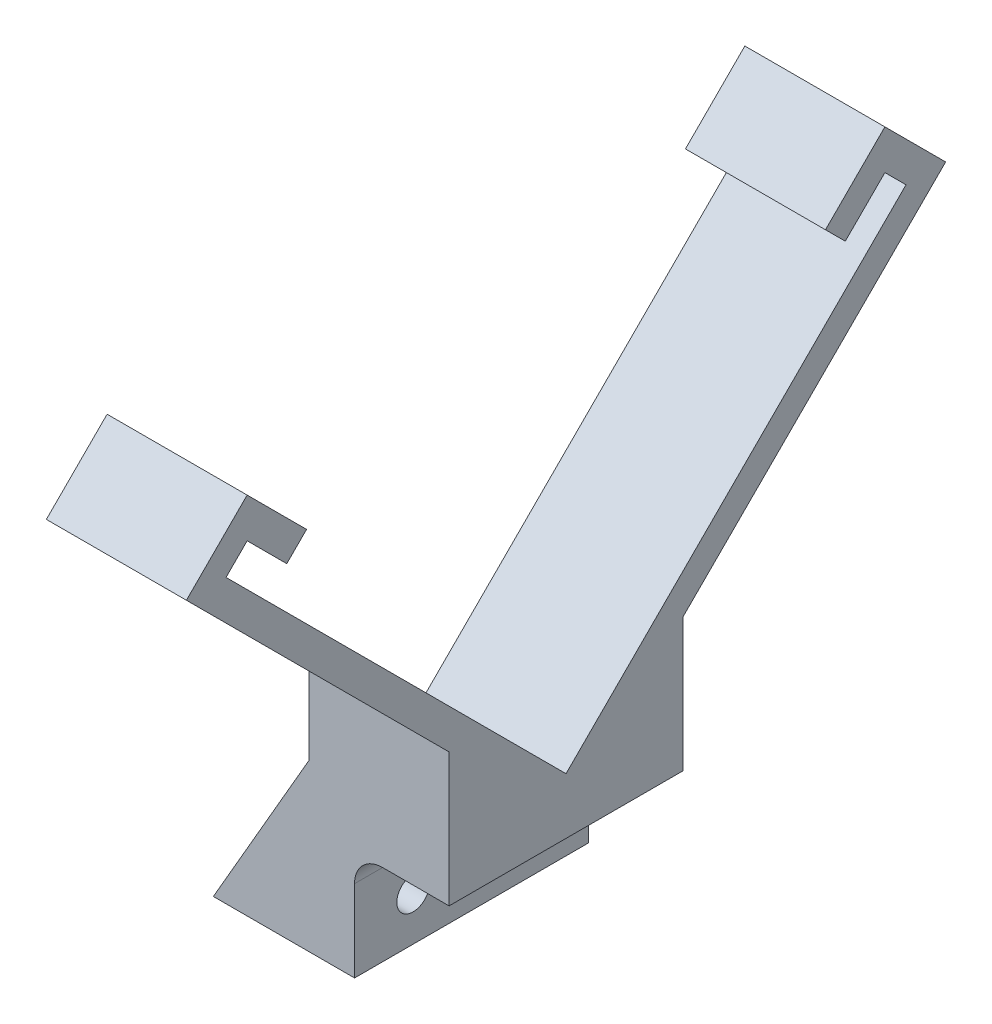
ISO-10303-21;
HEADER;
FILE_DESCRIPTION(('STEP AP214'),'2;1');
FILE_NAME('part.step','',(''),(''),'','','');
FILE_SCHEMA(('AUTOMOTIVE_DESIGN { 1 0 10303 214 1 1 1 1 }'));
ENDSEC;
DATA;
#1=APPLICATION_CONTEXT('core data for automotive mechanical design processes');
#2=APPLICATION_PROTOCOL_DEFINITION('international standard','automotive_design',2000,#1);
#3=PRODUCT_CONTEXT('',#1,'mechanical');
#4=PRODUCT('Part','Part','',(#3));
#5=PRODUCT_RELATED_PRODUCT_CATEGORY('part','',(#4));
#6=PRODUCT_DEFINITION_FORMATION('','',#4);
#7=PRODUCT_DEFINITION_CONTEXT('part definition',#1,'design');
#8=PRODUCT_DEFINITION('design','',#6,#7);
#9=PRODUCT_DEFINITION_SHAPE('','',#8);
#10=(LENGTH_UNIT() NAMED_UNIT(*) SI_UNIT(.MILLI.,.METRE.));
#11=(NAMED_UNIT(*) PLANE_ANGLE_UNIT() SI_UNIT($,.RADIAN.));
#12=(NAMED_UNIT(*) SI_UNIT($,.STERADIAN.) SOLID_ANGLE_UNIT());
#13=UNCERTAINTY_MEASURE_WITH_UNIT(LENGTH_MEASURE(1.E-05),#10,'distance_accuracy_value','');
#14=(GEOMETRIC_REPRESENTATION_CONTEXT(3) GLOBAL_UNCERTAINTY_ASSIGNED_CONTEXT((#13)) GLOBAL_UNIT_ASSIGNED_CONTEXT((#10,
#11,#12)) REPRESENTATION_CONTEXT('',''));
#15=CARTESIAN_POINT('',(0.,0.,0.));
#16=DIRECTION('',(0.,0.,1.));
#17=DIRECTION('',(1.,0.,0.));
#18=AXIS2_PLACEMENT_3D('',#15,#16,#17);
#19=CARTESIAN_POINT('',(0.,0.,25.05));
#20=DIRECTION('',(0.866025403784436,-0.500000000000004,0.));
#21=DIRECTION('',(0.500000000000004,0.866025403784436,0.));
#22=AXIS2_PLACEMENT_3D('',#19,#20,#21);
#23=PLANE('',#22);
#24=CARTESIAN_POINT('',(-7.50555349946521,-13.,6.275));
#25=DIRECTION('',(0.866025403784436,-0.500000000000004,0.));
#26=DIRECTION('',(0.500000000000004,0.866025403784436,0.));
#27=AXIS2_PLACEMENT_3D('',#24,#25,#26);
#28=ELLIPSE('',#27,2.0207259421637,1.75);
#29=CARTESIAN_POINT('',(-6.49519052838335,-11.25,6.275));
#30=VERTEX_POINT('',#29);
#31=EDGE_CURVE('E315',#30,#30,#28,.T.);
#32=ORIENTED_EDGE('',*,*,#31,.T.);
#33=EDGE_LOOP('',(#32));
#34=FACE_BOUND('',#33,.T.);
#35=CARTESIAN_POINT('',(-7.50555349946521,-13.,18.775));
#36=DIRECTION('',(0.866025403784436,-0.500000000000004,0.));
#37=DIRECTION('',(0.500000000000004,0.866025403784436,0.));
#38=AXIS2_PLACEMENT_3D('',#35,#36,#37);
#39=ELLIPSE('',#38,2.0207259421637,1.75);
#40=CARTESIAN_POINT('',(-6.49519052838336,-11.25,18.775));
#41=VERTEX_POINT('',#40);
#42=EDGE_CURVE('E321',#41,#41,#39,.T.);
#43=ORIENTED_EDGE('',*,*,#42,.T.);
#44=EDGE_LOOP('',(#43));
#45=FACE_BOUND('',#44,.T.);
#46=DIRECTION('',(-0.500000000000004,-0.866025403784436,0.));
#47=VECTOR('',#46,1.);
#48=CARTESIAN_POINT('',(0.,0.,0.));
#49=LINE('',#48,#47);
#50=CARTESIAN_POINT('',(0.,0.,0.));
#51=VERTEX_POINT('',#50);
#52=CARTESIAN_POINT('',(-10.247967278116,-17.75,0.));
#53=VERTEX_POINT('',#52);
#54=EDGE_CURVE('E184',#51,#53,#49,.T.);
#55=ORIENTED_EDGE('',*,*,#54,.T.);
#56=DIRECTION('',(0.,0.,-1.));
#57=VECTOR('',#56,1.);
#58=CARTESIAN_POINT('',(-10.247967278116,-17.75,25.05));
#59=LINE('',#58,#57);
#60=CARTESIAN_POINT('',(-10.247967278116,-17.75,25.05));
#61=VERTEX_POINT('',#60);
#62=EDGE_CURVE('E349',#61,#53,#59,.T.);
#63=ORIENTED_EDGE('',*,*,#62,.F.);
#64=DIRECTION('',(-0.500000000000004,-0.866025403784436,0.));
#65=VECTOR('',#64,1.);
#66=CARTESIAN_POINT('',(0.,0.,25.05));
#67=LINE('',#66,#65);
#68=CARTESIAN_POINT('',(0.,0.,25.05));
#69=VERTEX_POINT('',#68);
#70=EDGE_CURVE('E324',#69,#61,#67,.T.);
#71=ORIENTED_EDGE('',*,*,#70,.F.);
#72=DIRECTION('',(0.,0.,-1.));
#73=VECTOR('',#72,1.);
#74=CARTESIAN_POINT('',(0.,0.,25.05));
#75=LINE('',#74,#73);
#76=CARTESIAN_POINT('',(0.,0.,12.525));
#77=VERTEX_POINT('',#76);
#78=EDGE_CURVE('E352',#69,#77,#75,.T.);
#79=ORIENTED_EDGE('',*,*,#78,.T.);
#80=DIRECTION('',(0.,0.,1.));
#81=VECTOR('',#80,1.);
#82=CARTESIAN_POINT('',(0.,0.,25.05));
#83=LINE('',#82,#81);
#84=EDGE_CURVE('E285',#51,#77,#83,.T.);
#85=ORIENTED_EDGE('',*,*,#84,.F.);
#86=EDGE_LOOP('',(#55,#63,#71,#79,#85));
#87=FACE_BOUND('',#86,.T.);
#88=ADVANCED_FACE('F32',(#34,#45,#87),#23,.F.);
#89=CARTESIAN_POINT('',(-10.247967278116,-17.75,25.05));
#90=DIRECTION('',(0.,1.,0.));
#91=DIRECTION('',(0.,0.,1.));
#92=AXIS2_PLACEMENT_3D('',#89,#90,#91);
#93=PLANE('',#92);
#94=DIRECTION('',(1.,0.,0.));
#95=VECTOR('',#94,1.);
#96=CARTESIAN_POINT('',(-10.247967278116,-17.75,0.));
#97=LINE('',#96,#95);
#98=CARTESIAN_POINT('',(4.87601636094202,-17.75,0.));
#99=VERTEX_POINT('',#98);
#100=EDGE_CURVE('E337',#53,#99,#97,.T.);
#101=ORIENTED_EDGE('',*,*,#100,.T.);
#102=DIRECTION('',(0.,0.,-1.));
#103=VECTOR('',#102,1.);
#104=CARTESIAN_POINT('',(4.87601636094202,-17.75,25.05));
#105=LINE('',#104,#103);
#106=CARTESIAN_POINT('',(4.87601636094202,-17.75,25.05));
#107=VERTEX_POINT('',#106);
#108=EDGE_CURVE('E346',#107,#99,#105,.T.);
#109=ORIENTED_EDGE('',*,*,#108,.F.);
#110=DIRECTION('',(1.,0.,0.));
#111=VECTOR('',#110,1.);
#112=CARTESIAN_POINT('',(-10.247967278116,-17.75,25.05));
#113=LINE('',#112,#111);
#114=EDGE_CURVE('E326',#61,#107,#113,.T.);
#115=ORIENTED_EDGE('',*,*,#114,.F.);
#116=ORIENTED_EDGE('',*,*,#62,.T.);
#117=EDGE_LOOP('',(#101,#109,#115,#116));
#118=FACE_BOUND('',#117,.T.);
#119=ADVANCED_FACE('F388',(#118),#93,.F.);
#120=CARTESIAN_POINT('',(4.87601636094202,-17.75,25.05));
#121=DIRECTION('',(-1.,0.,0.));
#122=DIRECTION('',(0.,0.,1.));
#123=AXIS2_PLACEMENT_3D('',#120,#121,#122);
#124=PLANE('',#123);
#125=CARTESIAN_POINT('',(4.87601636094203,-13.,6.275));
#126=DIRECTION('',(1.,0.,0.));
#127=DIRECTION('',(0.,1.,0.));
#128=AXIS2_PLACEMENT_3D('',#125,#126,#127);
#129=CIRCLE('',#128,1.75);
#130=CARTESIAN_POINT('',(4.87601636094203,-11.25,6.275));
#131=VERTEX_POINT('',#130);
#132=EDGE_CURVE('E312',#131,#131,#129,.T.);
#133=ORIENTED_EDGE('',*,*,#132,.F.);
#134=EDGE_LOOP('',(#133));
#135=FACE_BOUND('',#134,.T.);
#136=CARTESIAN_POINT('',(4.87601636094203,-13.,18.775));
#137=DIRECTION('',(1.,0.,0.));
#138=DIRECTION('',(0.,1.,0.));
#139=AXIS2_PLACEMENT_3D('',#136,#137,#138);
#140=CIRCLE('',#139,1.75);
#141=CARTESIAN_POINT('',(4.87601636094203,-11.25,18.775));
#142=VERTEX_POINT('',#141);
#143=EDGE_CURVE('E318',#142,#142,#140,.T.);
#144=ORIENTED_EDGE('',*,*,#143,.F.);
#145=EDGE_LOOP('',(#144));
#146=FACE_BOUND('',#145,.T.);
#147=DIRECTION('',(0.,1.,0.));
#148=VECTOR('',#147,1.);
#149=CARTESIAN_POINT('',(4.87601636094202,-17.75,0.));
#150=LINE('',#149,#148);
#151=CARTESIAN_POINT('',(4.87601636094202,-9.,0.));
#152=VERTEX_POINT('',#151);
#153=EDGE_CURVE('E339',#99,#152,#150,.T.);
#154=ORIENTED_EDGE('',*,*,#153,.T.);
#155=DIRECTION('',(0.,0.,-1.));
#156=VECTOR('',#155,1.);
#157=CARTESIAN_POINT('',(4.87601636094202,-9.,25.05));
#158=LINE('',#157,#156);
#159=CARTESIAN_POINT('',(4.87601636094202,-9.,25.05));
#160=VERTEX_POINT('',#159);
#161=EDGE_CURVE('E55',#152,#160,#158,.F.);
#162=ORIENTED_EDGE('',*,*,#161,.T.);
#163=DIRECTION('',(0.,1.,0.));
#164=VECTOR('',#163,1.);
#165=CARTESIAN_POINT('',(4.87601636094202,-17.75,25.05));
#166=LINE('',#165,#164);
#167=EDGE_CURVE('E329',#107,#160,#166,.T.);
#168=ORIENTED_EDGE('',*,*,#167,.F.);
#169=ORIENTED_EDGE('',*,*,#108,.T.);
#170=EDGE_LOOP('',(#154,#162,#168,#169));
#171=FACE_BOUND('',#170,.T.);
#172=ADVANCED_FACE('F361',(#135,#146,#171),#124,.F.);
#173=CARTESIAN_POINT('',(4.87601636094202,-6.,25.05));
#174=DIRECTION('',(0.,1.,0.));
#175=DIRECTION('',(0.,0.,1.));
#176=AXIS2_PLACEMENT_3D('',#173,#174,#175);
#177=PLANE('',#176);
#178=DIRECTION('',(1.,0.,0.));
#179=VECTOR('',#178,1.);
#180=CARTESIAN_POINT('',(4.87601636094202,-6.,25.05));
#181=LINE('',#180,#179);
#182=CARTESIAN_POINT('',(7.87601636094203,-6.,25.05));
#183=VERTEX_POINT('',#182);
#184=CARTESIAN_POINT('',(15.,-6.,25.05));
#185=VERTEX_POINT('',#184);
#186=EDGE_CURVE('E331',#183,#185,#181,.T.);
#187=ORIENTED_EDGE('',*,*,#186,.F.);
#188=DIRECTION('',(0.,0.,-1.));
#189=VECTOR('',#188,1.);
#190=CARTESIAN_POINT('',(7.87601636094203,-6.,0.));
#191=LINE('',#190,#189);
#192=CARTESIAN_POINT('',(7.87601636094203,-6.,0.));
#193=VERTEX_POINT('',#192);
#194=EDGE_CURVE('E355',#183,#193,#191,.T.);
#195=ORIENTED_EDGE('',*,*,#194,.T.);
#196=DIRECTION('',(1.,0.,0.));
#197=VECTOR('',#196,1.);
#198=CARTESIAN_POINT('',(4.87601636094202,-6.,0.));
#199=LINE('',#198,#197);
#200=CARTESIAN_POINT('',(15.,-6.,0.));
#201=VERTEX_POINT('',#200);
#202=EDGE_CURVE('E341',#193,#201,#199,.T.);
#203=ORIENTED_EDGE('',*,*,#202,.T.);
#204=DIRECTION('',(0.,0.,-1.));
#205=VECTOR('',#204,1.);
#206=CARTESIAN_POINT('',(15.,-6.,25.05));
#207=LINE('',#206,#205);
#208=EDGE_CURVE('E335',#185,#201,#207,.T.);
#209=ORIENTED_EDGE('',*,*,#208,.F.);
#210=EDGE_LOOP('',(#187,#195,#203,#209));
#211=FACE_BOUND('',#210,.T.);
#212=ADVANCED_FACE('F369',(#211),#177,.F.);
#213=CARTESIAN_POINT('',(15.,-6.,25.05));
#214=DIRECTION('',(-1.,0.,0.));
#215=DIRECTION('',(0.,0.,1.));
#216=AXIS2_PLACEMENT_3D('',#213,#214,#215);
#217=PLANE('',#216);
#218=DIRECTION('',(0.,1.,0.));
#219=VECTOR('',#218,1.);
#220=CARTESIAN_POINT('',(15.,-6.,0.));
#221=LINE('',#220,#219);
#222=CARTESIAN_POINT('',(15.,8.28235931288071,0.));
#223=VERTEX_POINT('',#222);
#224=EDGE_CURVE('E327',#201,#223,#221,.T.);
#225=ORIENTED_EDGE('',*,*,#224,.T.);
#226=DIRECTION('',(0.,0.707106781186548,-0.707106781186548));
#227=VECTOR('',#226,1.);
#228=CARTESIAN_POINT('',(15.,36.4159992311072,-28.1336399182265));
#229=LINE('',#228,#227);
#230=CARTESIAN_POINT('',(15.,36.4159992311072,-28.1336399182265));
#231=VERTEX_POINT('',#230);
#232=EDGE_CURVE('E196',#223,#231,#229,.T.);
#233=ORIENTED_EDGE('',*,*,#232,.T.);
#234=DIRECTION('',(0.,0.707106781186547,0.707106781186547));
#235=VECTOR('',#234,1.);
#236=CARTESIAN_POINT('',(15.,42.9213816180234,-21.6282575313102));
#237=LINE('',#236,#235);
#238=CARTESIAN_POINT('',(15.,42.9213816180234,-21.6282575313102));
#239=VERTEX_POINT('',#238);
#240=EDGE_CURVE('E243',#231,#239,#237,.T.);
#241=ORIENTED_EDGE('',*,*,#240,.T.);
#242=DIRECTION('',(0.,-0.707106781186547,0.707106781186548));
#243=VECTOR('',#242,1.);
#244=CARTESIAN_POINT('',(15.,36.5574205873445,-15.2642965006313));
#245=LINE('',#244,#243);
#246=CARTESIAN_POINT('',(15.,36.5574205873445,-15.2642965006313));
#247=VERTEX_POINT('',#246);
#248=EDGE_CURVE('E246',#239,#247,#245,.T.);
#249=ORIENTED_EDGE('',*,*,#248,.T.);
#250=DIRECTION('',(0.,-0.707106781186549,-0.707106781186546));
#251=VECTOR('',#250,1.);
#252=CARTESIAN_POINT('',(15.,34.4361002437849,-17.385616844191));
#253=LINE('',#252,#251);
#254=CARTESIAN_POINT('',(15.,34.4361002437849,-17.385616844191));
#255=VERTEX_POINT('',#254);
#256=EDGE_CURVE('E249',#247,#255,#253,.T.);
#257=ORIENTED_EDGE('',*,*,#256,.T.);
#258=DIRECTION('',(0.,0.707106781186547,-0.707106781186548));
#259=VECTOR('',#258,1.);
#260=CARTESIAN_POINT('',(15.,38.6787409309041,-21.6282575313102));
#261=LINE('',#260,#259);
#262=CARTESIAN_POINT('',(15.,38.6787409309041,-21.6282575313102));
#263=VERTEX_POINT('',#262);
#264=EDGE_CURVE('E252',#255,#263,#261,.T.);
#265=ORIENTED_EDGE('',*,*,#264,.T.);
#266=DIRECTION('',(0.,-0.707106781186547,-0.707106781186548));
#267=VECTOR('',#266,1.);
#268=CARTESIAN_POINT('',(15.,36.4159992311072,-23.8909992311072));
#269=LINE('',#268,#267);
#270=CARTESIAN_POINT('',(15.,36.4159992311072,-23.8909992311072));
#271=VERTEX_POINT('',#270);
#272=EDGE_CURVE('E255',#263,#271,#269,.T.);
#273=ORIENTED_EDGE('',*,*,#272,.T.);
#274=DIRECTION('',(0.,-0.707106781186548,0.707106781186548));
#275=VECTOR('',#274,1.);
#276=CARTESIAN_POINT('',(15.,0.,12.525));
#277=LINE('',#276,#275);
#278=CARTESIAN_POINT('',(15.,0.,12.525));
#279=VERTEX_POINT('',#278);
#280=EDGE_CURVE('E258',#271,#279,#277,.T.);
#281=ORIENTED_EDGE('',*,*,#280,.T.);
#282=DIRECTION('',(0.,0.707106781186547,0.707106781186548));
#283=VECTOR('',#282,1.);
#284=CARTESIAN_POINT('',(15.,36.4159992311072,48.9409992311072));
#285=LINE('',#284,#283);
#286=CARTESIAN_POINT('',(15.,36.4159992311072,48.9409992311072));
#287=VERTEX_POINT('',#286);
#288=EDGE_CURVE('E261',#279,#287,#285,.T.);
#289=ORIENTED_EDGE('',*,*,#288,.T.);
#290=DIRECTION('',(0.,0.707106781186548,-0.707106781186548));
#291=VECTOR('',#290,1.);
#292=CARTESIAN_POINT('',(15.,38.6787409309041,46.6782575313102));
#293=LINE('',#292,#291);
#294=CARTESIAN_POINT('',(15.,38.6787409309041,46.6782575313102));
#295=VERTEX_POINT('',#294);
#296=EDGE_CURVE('E264',#287,#295,#293,.T.);
#297=ORIENTED_EDGE('',*,*,#296,.T.);
#298=DIRECTION('',(0.,-0.707106781186548,-0.707106781186548));
#299=VECTOR('',#298,1.);
#300=CARTESIAN_POINT('',(15.,34.4361002437849,42.435616844191));
#301=LINE('',#300,#299);
#302=CARTESIAN_POINT('',(15.,34.4361002437849,42.435616844191));
#303=VERTEX_POINT('',#302);
#304=EDGE_CURVE('E267',#295,#303,#301,.T.);
#305=ORIENTED_EDGE('',*,*,#304,.T.);
#306=DIRECTION('',(0.,0.707106781186548,-0.707106781186548));
#307=VECTOR('',#306,1.);
#308=CARTESIAN_POINT('',(15.,36.5574205873445,40.3142965006313));
#309=LINE('',#308,#307);
#310=CARTESIAN_POINT('',(15.,36.5574205873445,40.3142965006313));
#311=VERTEX_POINT('',#310);
#312=EDGE_CURVE('E270',#303,#311,#309,.T.);
#313=ORIENTED_EDGE('',*,*,#312,.T.);
#314=DIRECTION('',(0.,0.707106781186548,0.707106781186548));
#315=VECTOR('',#314,1.);
#316=CARTESIAN_POINT('',(15.,42.9213816180234,46.6782575313102));
#317=LINE('',#316,#315);
#318=CARTESIAN_POINT('',(15.,42.9213816180234,46.6782575313102));
#319=VERTEX_POINT('',#318);
#320=EDGE_CURVE('E273',#311,#319,#317,.T.);
#321=ORIENTED_EDGE('',*,*,#320,.T.);
#322=DIRECTION('',(0.,-0.707106781186547,0.707106781186547));
#323=VECTOR('',#322,1.);
#324=CARTESIAN_POINT('',(15.,36.4159992311072,53.1836399182265));
#325=LINE('',#324,#323);
#326=CARTESIAN_POINT('',(15.,36.4159992311072,53.1836399182265));
#327=VERTEX_POINT('',#326);
#328=EDGE_CURVE('E276',#319,#327,#325,.T.);
#329=ORIENTED_EDGE('',*,*,#328,.T.);
#330=DIRECTION('',(0.,-0.707106781186547,-0.707106781186548));
#331=VECTOR('',#330,1.);
#332=CARTESIAN_POINT('',(15.,8.28235931288071,25.05));
#333=LINE('',#332,#331);
#334=CARTESIAN_POINT('',(15.,8.28235931288071,25.05));
#335=VERTEX_POINT('',#334);
#336=EDGE_CURVE('E279',#327,#335,#333,.T.);
#337=ORIENTED_EDGE('',*,*,#336,.T.);
#338=DIRECTION('',(0.,1.,0.));
#339=VECTOR('',#338,1.);
#340=CARTESIAN_POINT('',(15.,-6.,25.05));
#341=LINE('',#340,#339);
#342=EDGE_CURVE('E333',#185,#335,#341,.T.);
#343=ORIENTED_EDGE('',*,*,#342,.F.);
#344=ORIENTED_EDGE('',*,*,#208,.T.);
#345=EDGE_LOOP('',(#225,#233,#241,#249,#257,#265,#273,#281,#289,#297,#305,#313,#321,#329,#337,
#343,#344));
#346=FACE_BOUND('',#345,.T.);
#347=ADVANCED_FACE('F372',(#346),#217,.F.);
#348=CARTESIAN_POINT('',(0.,0.,25.05));
#349=DIRECTION('',(0.,0.,-1.));
#350=DIRECTION('',(-1.,0.,0.));
#351=AXIS2_PLACEMENT_3D('',#348,#349,#350);
#352=PLANE('',#351);
#353=CARTESIAN_POINT('',(7.87601636094203,-9.,25.05));
#354=DIRECTION('',(0.,0.,-1.));
#355=DIRECTION('',(-1.,0.,0.));
#356=AXIS2_PLACEMENT_3D('',#353,#354,#355);
#357=CIRCLE('',#356,3.);
#358=EDGE_CURVE('E11',#160,#183,#357,.T.);
#359=ORIENTED_EDGE('',*,*,#358,.T.);
#360=ORIENTED_EDGE('',*,*,#186,.T.);
#361=ORIENTED_EDGE('',*,*,#342,.T.);
#362=DIRECTION('',(1.,0.,0.));
#363=VECTOR('',#362,1.);
#364=CARTESIAN_POINT('',(0.,8.28235931288071,25.05));
#365=LINE('',#364,#363);
#366=CARTESIAN_POINT('',(0.,8.28235931288071,25.05));
#367=VERTEX_POINT('',#366);
#368=EDGE_CURVE('E282',#367,#335,#365,.T.);
#369=ORIENTED_EDGE('',*,*,#368,.F.);
#370=DIRECTION('',(0.,-1.,0.));
#371=VECTOR('',#370,1.);
#372=CARTESIAN_POINT('',(0.,-6.,25.05));
#373=LINE('',#372,#371);
#374=EDGE_CURVE('E190',#367,#69,#373,.T.);
#375=ORIENTED_EDGE('',*,*,#374,.T.);
#376=ORIENTED_EDGE('',*,*,#70,.T.);
#377=ORIENTED_EDGE('',*,*,#114,.T.);
#378=ORIENTED_EDGE('',*,*,#167,.T.);
#379=EDGE_LOOP('',(#359,#360,#361,#369,#375,#376,#377,#378));
#380=FACE_BOUND('',#379,.T.);
#381=ADVANCED_FACE('F366',(#380),#352,.F.);
#382=CARTESIAN_POINT('',(0.,0.,0.));
#383=DIRECTION('',(0.,0.,-1.));
#384=DIRECTION('',(-1.,0.,0.));
#385=AXIS2_PLACEMENT_3D('',#382,#383,#384);
#386=PLANE('',#385);
#387=ORIENTED_EDGE('',*,*,#202,.F.);
#388=CARTESIAN_POINT('',(7.87601636094203,-9.,0.));
#389=DIRECTION('',(0.,0.,-1.));
#390=DIRECTION('',(-1.,0.,0.));
#391=AXIS2_PLACEMENT_3D('',#388,#389,#390);
#392=CIRCLE('',#391,3.);
#393=EDGE_CURVE('E40',#193,#152,#392,.F.);
#394=ORIENTED_EDGE('',*,*,#393,.T.);
#395=ORIENTED_EDGE('',*,*,#153,.F.);
#396=ORIENTED_EDGE('',*,*,#100,.F.);
#397=ORIENTED_EDGE('',*,*,#54,.F.);
#398=DIRECTION('',(0.,1.,0.));
#399=VECTOR('',#398,1.);
#400=CARTESIAN_POINT('',(0.,8.28235931288071,0.));
#401=LINE('',#400,#399);
#402=CARTESIAN_POINT('',(0.,8.28235931288071,0.));
#403=VERTEX_POINT('',#402);
#404=EDGE_CURVE('E176',#51,#403,#401,.T.);
#405=ORIENTED_EDGE('',*,*,#404,.T.);
#406=DIRECTION('',(1.,0.,0.));
#407=VECTOR('',#406,1.);
#408=CARTESIAN_POINT('',(0.,8.28235931288071,0.));
#409=LINE('',#408,#407);
#410=EDGE_CURVE('E181',#403,#223,#409,.T.);
#411=ORIENTED_EDGE('',*,*,#410,.T.);
#412=ORIENTED_EDGE('',*,*,#224,.F.);
#413=EDGE_LOOP('',(#387,#394,#395,#396,#397,#405,#411,#412));
#414=FACE_BOUND('',#413,.T.);
#415=ADVANCED_FACE('F179',(#414),#386,.T.);
#416=CARTESIAN_POINT('',(-10.247967278116,-13.,18.775));
#417=DIRECTION('',(1.,0.,0.));
#418=DIRECTION('',(0.,1.,0.));
#419=AXIS2_PLACEMENT_3D('',#416,#417,#418);
#420=CYLINDRICAL_SURFACE('',#419,1.75);
#421=ORIENTED_EDGE('',*,*,#143,.T.);
#422=EDGE_LOOP('',(#421));
#423=FACE_BOUND('',#422,.T.);
#424=ORIENTED_EDGE('',*,*,#42,.F.);
#425=EDGE_LOOP('',(#424));
#426=FACE_BOUND('',#425,.T.);
#427=ADVANCED_FACE('F405',(#423,#426),#420,.F.);
#428=CARTESIAN_POINT('',(-10.247967278116,-13.,6.275));
#429=DIRECTION('',(1.,0.,0.));
#430=DIRECTION('',(0.,1.,0.));
#431=AXIS2_PLACEMENT_3D('',#428,#429,#430);
#432=CYLINDRICAL_SURFACE('',#431,1.75);
#433=ORIENTED_EDGE('',*,*,#132,.T.);
#434=EDGE_LOOP('',(#433));
#435=FACE_BOUND('',#434,.T.);
#436=ORIENTED_EDGE('',*,*,#31,.F.);
#437=EDGE_LOOP('',(#436));
#438=FACE_BOUND('',#437,.T.);
#439=ADVANCED_FACE('F410',(#435,#438),#432,.F.);
#440=CARTESIAN_POINT('',(7.87601636094203,-9.,25.05));
#441=DIRECTION('',(0.,0.,1.));
#442=DIRECTION('',(1.,0.,0.));
#443=AXIS2_PLACEMENT_3D('',#440,#441,#442);
#444=CYLINDRICAL_SURFACE('',#443,3.);
#445=ORIENTED_EDGE('',*,*,#358,.F.);
#446=ORIENTED_EDGE('',*,*,#161,.F.);
#447=ORIENTED_EDGE('',*,*,#393,.F.);
#448=ORIENTED_EDGE('',*,*,#194,.F.);
#449=EDGE_LOOP('',(#445,#446,#447,#448));
#450=FACE_BOUND('',#449,.T.);
#451=ADVANCED_FACE('F34',(#450),#444,.F.);
#452=CARTESIAN_POINT('',(0.,0.,0.));
#453=DIRECTION('',(1.,0.,0.));
#454=DIRECTION('',(0.,0.,-1.));
#455=AXIS2_PLACEMENT_3D('',#452,#453,#454);
#456=PLANE('',#455);
#457=ORIENTED_EDGE('',*,*,#404,.F.);
#458=ORIENTED_EDGE('',*,*,#84,.T.);
#459=DIRECTION('',(0.,-0.707106781186548,0.707106781186548));
#460=VECTOR('',#459,1.);
#461=CARTESIAN_POINT('',(0.,0.,12.525));
#462=LINE('',#461,#460);
#463=CARTESIAN_POINT('',(0.,36.4159992311072,-23.8909992311072));
#464=VERTEX_POINT('',#463);
#465=EDGE_CURVE('E47',#464,#77,#462,.T.);
#466=ORIENTED_EDGE('',*,*,#465,.F.);
#467=DIRECTION('',(0.,-0.707106781186547,-0.707106781186548));
#468=VECTOR('',#467,1.);
#469=CARTESIAN_POINT('',(0.,36.4159992311072,-23.8909992311072));
#470=LINE('',#469,#468);
#471=CARTESIAN_POINT('',(0.,38.6787409309041,-21.6282575313102));
#472=VERTEX_POINT('',#471);
#473=EDGE_CURVE('E218',#472,#464,#470,.T.);
#474=ORIENTED_EDGE('',*,*,#473,.F.);
#475=DIRECTION('',(0.,0.707106781186547,-0.707106781186548));
#476=VECTOR('',#475,1.);
#477=CARTESIAN_POINT('',(0.,38.6787409309041,-21.6282575313102));
#478=LINE('',#477,#476);
#479=CARTESIAN_POINT('',(0.,34.4361002437849,-17.385616844191));
#480=VERTEX_POINT('',#479);
#481=EDGE_CURVE('E215',#480,#472,#478,.T.);
#482=ORIENTED_EDGE('',*,*,#481,.F.);
#483=DIRECTION('',(0.,-0.707106781186549,-0.707106781186546));
#484=VECTOR('',#483,1.);
#485=CARTESIAN_POINT('',(0.,34.4361002437849,-17.385616844191));
#486=LINE('',#485,#484);
#487=CARTESIAN_POINT('',(0.,36.5574205873445,-15.2642965006313));
#488=VERTEX_POINT('',#487);
#489=EDGE_CURVE('E212',#488,#480,#486,.T.);
#490=ORIENTED_EDGE('',*,*,#489,.F.);
#491=DIRECTION('',(0.,-0.707106781186547,0.707106781186548));
#492=VECTOR('',#491,1.);
#493=CARTESIAN_POINT('',(0.,36.5574205873445,-15.2642965006313));
#494=LINE('',#493,#492);
#495=CARTESIAN_POINT('',(0.,42.9213816180234,-21.6282575313102));
#496=VERTEX_POINT('',#495);
#497=EDGE_CURVE('E206',#496,#488,#494,.T.);
#498=ORIENTED_EDGE('',*,*,#497,.F.);
#499=DIRECTION('',(0.,0.707106781186547,0.707106781186547));
#500=VECTOR('',#499,1.);
#501=CARTESIAN_POINT('',(0.,42.9213816180234,-21.6282575313102));
#502=LINE('',#501,#500);
#503=CARTESIAN_POINT('',(0.,36.4159992311072,-28.1336399182265));
#504=VERTEX_POINT('',#503);
#505=EDGE_CURVE('E204',#504,#496,#502,.T.);
#506=ORIENTED_EDGE('',*,*,#505,.F.);
#507=DIRECTION('',(0.,0.707106781186548,-0.707106781186548));
#508=VECTOR('',#507,1.);
#509=CARTESIAN_POINT('',(0.,36.4159992311072,-28.1336399182265));
#510=LINE('',#509,#508);
#511=EDGE_CURVE('E189',#403,#504,#510,.T.);
#512=ORIENTED_EDGE('',*,*,#511,.F.);
#513=EDGE_LOOP('',(#457,#458,#466,#474,#482,#490,#498,#506,#512));
#514=FACE_BOUND('',#513,.T.);
#515=ADVANCED_FACE('F201',(#514),#456,.F.);
#516=DIRECTION('',(0.,0.707106781186547,0.707106781186548));
#517=VECTOR('',#516,1.);
#518=CARTESIAN_POINT('',(0.,36.4159992311072,48.9409992311072));
#519=LINE('',#518,#517);
#520=CARTESIAN_POINT('',(0.,36.4159992311072,48.9409992311072));
#521=VERTEX_POINT('',#520);
#522=EDGE_CURVE('E222',#77,#521,#519,.T.);
#523=ORIENTED_EDGE('',*,*,#522,.F.);
#524=ORIENTED_EDGE('',*,*,#78,.F.);
#525=ORIENTED_EDGE('',*,*,#374,.F.);
#526=DIRECTION('',(0.,-0.707106781186547,-0.707106781186548));
#527=VECTOR('',#526,1.);
#528=CARTESIAN_POINT('',(0.,8.28235931288071,25.05));
#529=LINE('',#528,#527);
#530=CARTESIAN_POINT('',(0.,36.4159992311072,53.1836399182265));
#531=VERTEX_POINT('',#530);
#532=EDGE_CURVE('E198',#531,#367,#529,.T.);
#533=ORIENTED_EDGE('',*,*,#532,.F.);
#534=DIRECTION('',(0.,-0.707106781186547,0.707106781186547));
#535=VECTOR('',#534,1.);
#536=CARTESIAN_POINT('',(0.,36.4159992311072,53.1836399182265));
#537=LINE('',#536,#535);
#538=CARTESIAN_POINT('',(0.,42.9213816180234,46.6782575313102));
#539=VERTEX_POINT('',#538);
#540=EDGE_CURVE('E237',#539,#531,#537,.T.);
#541=ORIENTED_EDGE('',*,*,#540,.F.);
#542=DIRECTION('',(0.,0.707106781186548,0.707106781186548));
#543=VECTOR('',#542,1.);
#544=CARTESIAN_POINT('',(0.,42.9213816180234,46.6782575313102));
#545=LINE('',#544,#543);
#546=CARTESIAN_POINT('',(0.,36.5574205873445,40.3142965006313));
#547=VERTEX_POINT('',#546);
#548=EDGE_CURVE('E234',#547,#539,#545,.T.);
#549=ORIENTED_EDGE('',*,*,#548,.F.);
#550=DIRECTION('',(0.,0.707106781186548,-0.707106781186548));
#551=VECTOR('',#550,1.);
#552=CARTESIAN_POINT('',(0.,36.5574205873445,40.3142965006313));
#553=LINE('',#552,#551);
#554=CARTESIAN_POINT('',(0.,34.4361002437849,42.435616844191));
#555=VERTEX_POINT('',#554);
#556=EDGE_CURVE('E231',#555,#547,#553,.T.);
#557=ORIENTED_EDGE('',*,*,#556,.F.);
#558=DIRECTION('',(0.,-0.707106781186548,-0.707106781186548));
#559=VECTOR('',#558,1.);
#560=CARTESIAN_POINT('',(0.,34.4361002437849,42.435616844191));
#561=LINE('',#560,#559);
#562=CARTESIAN_POINT('',(0.,38.6787409309041,46.6782575313102));
#563=VERTEX_POINT('',#562);
#564=EDGE_CURVE('E228',#563,#555,#561,.T.);
#565=ORIENTED_EDGE('',*,*,#564,.F.);
#566=DIRECTION('',(0.,0.707106781186548,-0.707106781186548));
#567=VECTOR('',#566,1.);
#568=CARTESIAN_POINT('',(0.,38.6787409309041,46.6782575313102));
#569=LINE('',#568,#567);
#570=EDGE_CURVE('E225',#521,#563,#569,.T.);
#571=ORIENTED_EDGE('',*,*,#570,.F.);
#572=EDGE_LOOP('',(#523,#524,#525,#533,#541,#549,#557,#565,#571));
#573=FACE_BOUND('',#572,.T.);
#574=ADVANCED_FACE('F381',(#573),#456,.F.);
#575=CARTESIAN_POINT('',(0.,8.28235931288071,25.05));
#576=DIRECTION('',(0.,-0.707106781186548,0.707106781186547));
#577=DIRECTION('',(0.,-0.707106781186547,-0.707106781186548));
#578=AXIS2_PLACEMENT_3D('',#575,#576,#577);
#579=PLANE('',#578);
#580=ORIENTED_EDGE('',*,*,#336,.F.);
#581=DIRECTION('',(1.,0.,0.));
#582=VECTOR('',#581,1.);
#583=CARTESIAN_POINT('',(0.,36.4159992311072,53.1836399182265));
#584=LINE('',#583,#582);
#585=EDGE_CURVE('E286',#531,#327,#584,.T.);
#586=ORIENTED_EDGE('',*,*,#585,.F.);
#587=ORIENTED_EDGE('',*,*,#532,.T.);
#588=ORIENTED_EDGE('',*,*,#368,.T.);
#589=EDGE_LOOP('',(#580,#586,#587,#588));
#590=FACE_BOUND('',#589,.T.);
#591=ADVANCED_FACE('F377',(#590),#579,.T.);
#592=CARTESIAN_POINT('',(0.,36.4159992311072,53.1836399182265));
#593=DIRECTION('',(0.,0.707106781186547,0.707106781186547));
#594=DIRECTION('',(0.,-0.707106781186548,0.707106781186548));
#595=AXIS2_PLACEMENT_3D('',#592,#593,#594);
#596=PLANE('',#595);
#597=ORIENTED_EDGE('',*,*,#328,.F.);
#598=DIRECTION('',(1.,0.,0.));
#599=VECTOR('',#598,1.);
#600=CARTESIAN_POINT('',(0.,42.9213816180234,46.6782575313102));
#601=LINE('',#600,#599);
#602=EDGE_CURVE('E288',#539,#319,#601,.T.);
#603=ORIENTED_EDGE('',*,*,#602,.F.);
#604=ORIENTED_EDGE('',*,*,#540,.T.);
#605=ORIENTED_EDGE('',*,*,#585,.T.);
#606=EDGE_LOOP('',(#597,#603,#604,#605));
#607=FACE_BOUND('',#606,.T.);
#608=ADVANCED_FACE('F459',(#607),#596,.T.);
#609=CARTESIAN_POINT('',(0.,42.9213816180234,46.6782575313102));
#610=DIRECTION('',(0.,0.707106781186547,-0.707106781186547));
#611=DIRECTION('',(0.,0.707106781186548,0.707106781186548));
#612=AXIS2_PLACEMENT_3D('',#609,#610,#611);
#613=PLANE('',#612);
#614=ORIENTED_EDGE('',*,*,#320,.F.);
#615=DIRECTION('',(1.,0.,0.));
#616=VECTOR('',#615,1.);
#617=CARTESIAN_POINT('',(0.,36.5574205873445,40.3142965006313));
#618=LINE('',#617,#616);
#619=EDGE_CURVE('E290',#547,#311,#618,.T.);
#620=ORIENTED_EDGE('',*,*,#619,.F.);
#621=ORIENTED_EDGE('',*,*,#548,.T.);
#622=ORIENTED_EDGE('',*,*,#602,.T.);
#623=EDGE_LOOP('',(#614,#620,#621,#622));
#624=FACE_BOUND('',#623,.T.);
#625=ADVANCED_FACE('F455',(#624),#613,.T.);
#626=CARTESIAN_POINT('',(0.,36.5574205873445,40.3142965006313));
#627=DIRECTION('',(0.,-0.707106781186547,-0.707106781186547));
#628=DIRECTION('',(0.,0.707106781186548,-0.707106781186548));
#629=AXIS2_PLACEMENT_3D('',#626,#627,#628);
#630=PLANE('',#629);
#631=ORIENTED_EDGE('',*,*,#312,.F.);
#632=DIRECTION('',(1.,0.,0.));
#633=VECTOR('',#632,1.);
#634=CARTESIAN_POINT('',(0.,34.4361002437849,42.435616844191));
#635=LINE('',#634,#633);
#636=EDGE_CURVE('E292',#555,#303,#635,.T.);
#637=ORIENTED_EDGE('',*,*,#636,.F.);
#638=ORIENTED_EDGE('',*,*,#556,.T.);
#639=ORIENTED_EDGE('',*,*,#619,.T.);
#640=EDGE_LOOP('',(#631,#637,#638,#639));
#641=FACE_BOUND('',#640,.T.);
#642=ADVANCED_FACE('F451',(#641),#630,.T.);
#643=CARTESIAN_POINT('',(0.,34.4361002437849,42.435616844191));
#644=DIRECTION('',(0.,-0.707106781186547,0.707106781186547));
#645=DIRECTION('',(0.,-0.707106781186548,-0.707106781186548));
#646=AXIS2_PLACEMENT_3D('',#643,#644,#645);
#647=PLANE('',#646);
#648=ORIENTED_EDGE('',*,*,#304,.F.);
#649=DIRECTION('',(1.,0.,0.));
#650=VECTOR('',#649,1.);
#651=CARTESIAN_POINT('',(0.,38.6787409309041,46.6782575313102));
#652=LINE('',#651,#650);
#653=EDGE_CURVE('E294',#563,#295,#652,.T.);
#654=ORIENTED_EDGE('',*,*,#653,.F.);
#655=ORIENTED_EDGE('',*,*,#564,.T.);
#656=ORIENTED_EDGE('',*,*,#636,.T.);
#657=EDGE_LOOP('',(#648,#654,#655,#656));
#658=FACE_BOUND('',#657,.T.);
#659=ADVANCED_FACE('F447',(#658),#647,.T.);
#660=CARTESIAN_POINT('',(0.,38.6787409309041,46.6782575313102));
#661=DIRECTION('',(0.,-0.707106781186547,-0.707106781186547));
#662=DIRECTION('',(0.,0.707106781186548,-0.707106781186548));
#663=AXIS2_PLACEMENT_3D('',#660,#661,#662);
#664=PLANE('',#663);
#665=ORIENTED_EDGE('',*,*,#296,.F.);
#666=DIRECTION('',(1.,0.,0.));
#667=VECTOR('',#666,1.);
#668=CARTESIAN_POINT('',(0.,36.4159992311072,48.9409992311072));
#669=LINE('',#668,#667);
#670=EDGE_CURVE('E296',#521,#287,#669,.T.);
#671=ORIENTED_EDGE('',*,*,#670,.F.);
#672=ORIENTED_EDGE('',*,*,#570,.T.);
#673=ORIENTED_EDGE('',*,*,#653,.T.);
#674=EDGE_LOOP('',(#665,#671,#672,#673));
#675=FACE_BOUND('',#674,.T.);
#676=ADVANCED_FACE('F443',(#675),#664,.T.);
#677=CARTESIAN_POINT('',(0.,36.4159992311072,48.9409992311072));
#678=DIRECTION('',(0.,0.707106781186548,-0.707106781186547));
#679=DIRECTION('',(0.,0.707106781186547,0.707106781186548));
#680=AXIS2_PLACEMENT_3D('',#677,#678,#679);
#681=PLANE('',#680);
#682=ORIENTED_EDGE('',*,*,#288,.F.);
#683=DIRECTION('',(1.,0.,0.));
#684=VECTOR('',#683,1.);
#685=CARTESIAN_POINT('',(0.,0.,12.525));
#686=LINE('',#685,#684);
#687=EDGE_CURVE('E298',#77,#279,#686,.T.);
#688=ORIENTED_EDGE('',*,*,#687,.F.);
#689=ORIENTED_EDGE('',*,*,#522,.T.);
#690=ORIENTED_EDGE('',*,*,#670,.T.);
#691=EDGE_LOOP('',(#682,#688,#689,#690));
#692=FACE_BOUND('',#691,.T.);
#693=ADVANCED_FACE('F440',(#692),#681,.T.);
#694=CARTESIAN_POINT('',(0.,0.,12.525));
#695=DIRECTION('',(0.,0.707106781186547,0.707106781186547));
#696=DIRECTION('',(0.,-0.707106781186548,0.707106781186548));
#697=AXIS2_PLACEMENT_3D('',#694,#695,#696);
#698=PLANE('',#697);
#699=ORIENTED_EDGE('',*,*,#280,.F.);
#700=DIRECTION('',(1.,0.,0.));
#701=VECTOR('',#700,1.);
#702=CARTESIAN_POINT('',(0.,36.4159992311072,-23.8909992311072));
#703=LINE('',#702,#701);
#704=EDGE_CURVE('E300',#464,#271,#703,.T.);
#705=ORIENTED_EDGE('',*,*,#704,.F.);
#706=ORIENTED_EDGE('',*,*,#465,.T.);
#707=ORIENTED_EDGE('',*,*,#687,.T.);
#708=EDGE_LOOP('',(#699,#705,#706,#707));
#709=FACE_BOUND('',#708,.T.);
#710=ADVANCED_FACE('F436',(#709),#698,.T.);
#711=CARTESIAN_POINT('',(0.,36.4159992311072,-23.8909992311072));
#712=DIRECTION('',(0.,-0.707106781186548,0.707106781186547));
#713=DIRECTION('',(0.,-0.707106781186547,-0.707106781186548));
#714=AXIS2_PLACEMENT_3D('',#711,#712,#713);
#715=PLANE('',#714);
#716=ORIENTED_EDGE('',*,*,#272,.F.);
#717=DIRECTION('',(1.,0.,0.));
#718=VECTOR('',#717,1.);
#719=CARTESIAN_POINT('',(0.,38.6787409309041,-21.6282575313102));
#720=LINE('',#719,#718);
#721=EDGE_CURVE('E302',#472,#263,#720,.T.);
#722=ORIENTED_EDGE('',*,*,#721,.F.);
#723=ORIENTED_EDGE('',*,*,#473,.T.);
#724=ORIENTED_EDGE('',*,*,#704,.T.);
#725=EDGE_LOOP('',(#716,#722,#723,#724));
#726=FACE_BOUND('',#725,.T.);
#727=ADVANCED_FACE('F432',(#726),#715,.T.);
#728=CARTESIAN_POINT('',(0.,38.6787409309041,-21.6282575313102));
#729=DIRECTION('',(0.,-0.707106781186548,-0.707106781186547));
#730=DIRECTION('',(0.,0.707106781186547,-0.707106781186548));
#731=AXIS2_PLACEMENT_3D('',#728,#729,#730);
#732=PLANE('',#731);
#733=ORIENTED_EDGE('',*,*,#264,.F.);
#734=DIRECTION('',(1.,0.,0.));
#735=VECTOR('',#734,1.);
#736=CARTESIAN_POINT('',(0.,34.4361002437849,-17.385616844191));
#737=LINE('',#736,#735);
#738=EDGE_CURVE('E304',#480,#255,#737,.T.);
#739=ORIENTED_EDGE('',*,*,#738,.F.);
#740=ORIENTED_EDGE('',*,*,#481,.T.);
#741=ORIENTED_EDGE('',*,*,#721,.T.);
#742=EDGE_LOOP('',(#733,#739,#740,#741));
#743=FACE_BOUND('',#742,.T.);
#744=ADVANCED_FACE('F428',(#743),#732,.T.);
#745=CARTESIAN_POINT('',(0.,34.4361002437849,-17.385616844191));
#746=DIRECTION('',(0.,-0.707106781186546,0.707106781186549));
#747=DIRECTION('',(0.,-0.707106781186549,-0.707106781186546));
#748=AXIS2_PLACEMENT_3D('',#745,#746,#747);
#749=PLANE('',#748);
#750=ORIENTED_EDGE('',*,*,#256,.F.);
#751=DIRECTION('',(1.,0.,0.));
#752=VECTOR('',#751,1.);
#753=CARTESIAN_POINT('',(0.,36.5574205873445,-15.2642965006313));
#754=LINE('',#753,#752);
#755=EDGE_CURVE('E306',#488,#247,#754,.T.);
#756=ORIENTED_EDGE('',*,*,#755,.F.);
#757=ORIENTED_EDGE('',*,*,#489,.T.);
#758=ORIENTED_EDGE('',*,*,#738,.T.);
#759=EDGE_LOOP('',(#750,#756,#757,#758));
#760=FACE_BOUND('',#759,.T.);
#761=ADVANCED_FACE('F424',(#760),#749,.T.);
#762=CARTESIAN_POINT('',(0.,36.5574205873445,-15.2642965006313));
#763=DIRECTION('',(0.,0.707106781186548,0.707106781186547));
#764=DIRECTION('',(0.,-0.707106781186547,0.707106781186548));
#765=AXIS2_PLACEMENT_3D('',#762,#763,#764);
#766=PLANE('',#765);
#767=ORIENTED_EDGE('',*,*,#248,.F.);
#768=DIRECTION('',(1.,0.,0.));
#769=VECTOR('',#768,1.);
#770=CARTESIAN_POINT('',(0.,42.9213816180234,-21.6282575313102));
#771=LINE('',#770,#769);
#772=EDGE_CURVE('E308',#496,#239,#771,.T.);
#773=ORIENTED_EDGE('',*,*,#772,.F.);
#774=ORIENTED_EDGE('',*,*,#497,.T.);
#775=ORIENTED_EDGE('',*,*,#755,.T.);
#776=EDGE_LOOP('',(#767,#773,#774,#775));
#777=FACE_BOUND('',#776,.T.);
#778=ADVANCED_FACE('F420',(#777),#766,.T.);
#779=CARTESIAN_POINT('',(0.,42.9213816180234,-21.6282575313102));
#780=DIRECTION('',(0.,0.707106781186547,-0.707106781186547));
#781=DIRECTION('',(0.,0.707106781186548,0.707106781186548));
#782=AXIS2_PLACEMENT_3D('',#779,#780,#781);
#783=PLANE('',#782);
#784=ORIENTED_EDGE('',*,*,#240,.F.);
#785=DIRECTION('',(1.,0.,0.));
#786=VECTOR('',#785,1.);
#787=CARTESIAN_POINT('',(0.,36.4159992311072,-28.1336399182265));
#788=LINE('',#787,#786);
#789=EDGE_CURVE('E197',#504,#231,#788,.T.);
#790=ORIENTED_EDGE('',*,*,#789,.F.);
#791=ORIENTED_EDGE('',*,*,#505,.T.);
#792=ORIENTED_EDGE('',*,*,#772,.T.);
#793=EDGE_LOOP('',(#784,#790,#791,#792));
#794=FACE_BOUND('',#793,.T.);
#795=ADVANCED_FACE('F417',(#794),#783,.T.);
#796=CARTESIAN_POINT('',(0.,36.4159992311072,-28.1336399182265));
#797=DIRECTION('',(0.,-0.707106781186547,-0.707106781186547));
#798=DIRECTION('',(0.,0.707106781186548,-0.707106781186548));
#799=AXIS2_PLACEMENT_3D('',#796,#797,#798);
#800=PLANE('',#799);
#801=ORIENTED_EDGE('',*,*,#232,.F.);
#802=ORIENTED_EDGE('',*,*,#410,.F.);
#803=ORIENTED_EDGE('',*,*,#511,.T.);
#804=ORIENTED_EDGE('',*,*,#789,.T.);
#805=EDGE_LOOP('',(#801,#802,#803,#804));
#806=FACE_BOUND('',#805,.T.);
#807=ADVANCED_FACE('F194',(#806),#800,.T.);
#808=CLOSED_SHELL('',(#88,#119,#172,#212,#347,#381,#415,#427,#439,#451,#515,#574,#591,#608,#625,
#642,#659,#676,#693,#710,#727,#744,#761,#778,#795,#807));
#809=MANIFOLD_SOLID_BREP('B2',#808);
#810=ADVANCED_BREP_SHAPE_REPRESENTATION('',(#18,#809),#14);
#811=SHAPE_DEFINITION_REPRESENTATION(#9,#810);
ENDSEC;
END-ISO-10303-21;
